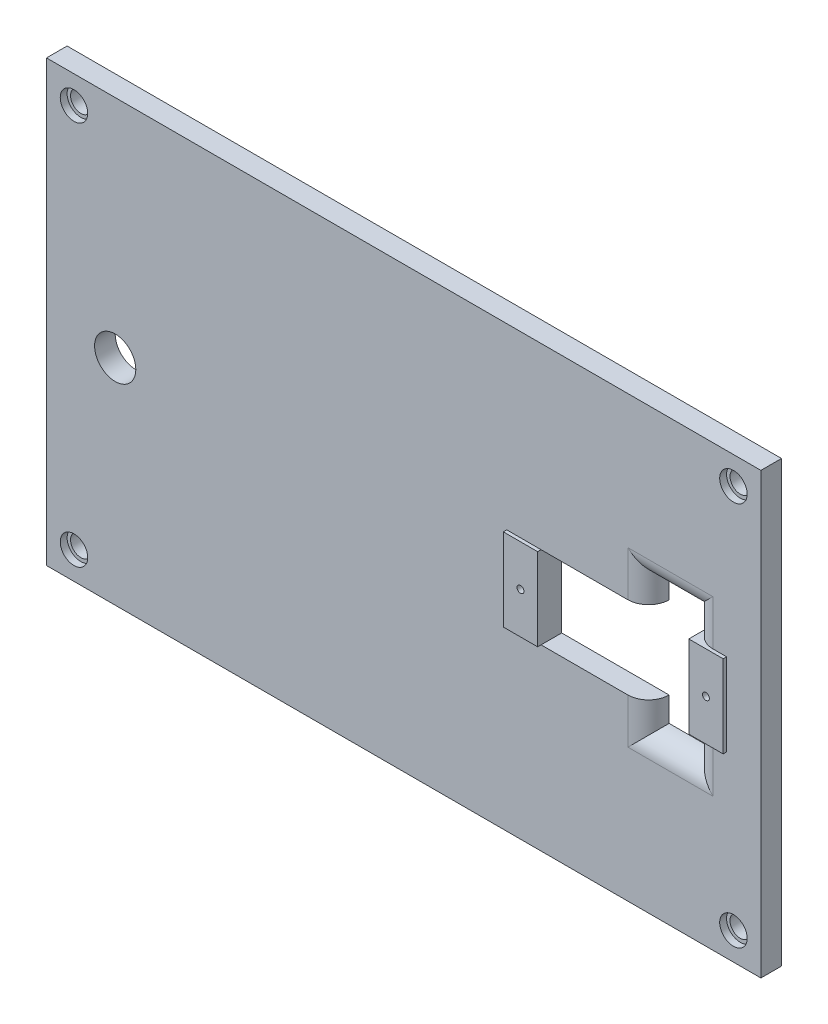
ISO-10303-21;
HEADER;
FILE_DESCRIPTION(('STEP AP214'),'2;1');
FILE_NAME('part.step','',(''),(''),'','','');
FILE_SCHEMA(('AUTOMOTIVE_DESIGN { 1 0 10303 214 1 1 1 1 }'));
ENDSEC;
DATA;
#1=APPLICATION_CONTEXT('core data for automotive mechanical design processes');
#2=APPLICATION_PROTOCOL_DEFINITION('international standard','automotive_design',2000,#1);
#3=PRODUCT_CONTEXT('',#1,'mechanical');
#4=PRODUCT('Part','Part','',(#3));
#5=PRODUCT_RELATED_PRODUCT_CATEGORY('part','',(#4));
#6=PRODUCT_DEFINITION_FORMATION('','',#4);
#7=PRODUCT_DEFINITION_CONTEXT('part definition',#1,'design');
#8=PRODUCT_DEFINITION('design','',#6,#7);
#9=PRODUCT_DEFINITION_SHAPE('','',#8);
#10=(LENGTH_UNIT() NAMED_UNIT(*) SI_UNIT(.MILLI.,.METRE.));
#11=(NAMED_UNIT(*) PLANE_ANGLE_UNIT() SI_UNIT($,.RADIAN.));
#12=(NAMED_UNIT(*) SI_UNIT($,.STERADIAN.) SOLID_ANGLE_UNIT());
#13=UNCERTAINTY_MEASURE_WITH_UNIT(LENGTH_MEASURE(1.E-05),#10,'distance_accuracy_value','');
#14=(GEOMETRIC_REPRESENTATION_CONTEXT(3) GLOBAL_UNCERTAINTY_ASSIGNED_CONTEXT((#13)) GLOBAL_UNIT_ASSIGNED_CONTEXT((#10,
#11,#12)) REPRESENTATION_CONTEXT('',''));
#15=CARTESIAN_POINT('',(0.,0.,0.));
#16=DIRECTION('',(0.,0.,1.));
#17=DIRECTION('',(1.,0.,0.));
#18=AXIS2_PLACEMENT_3D('',#15,#16,#17);
#19=CARTESIAN_POINT('',(0.,0.,3.));
#20=DIRECTION('',(0.,0.,1.));
#21=DIRECTION('',(1.,0.,0.));
#22=AXIS2_PLACEMENT_3D('',#19,#20,#21);
#23=PLANE('',#22);
#24=CARTESIAN_POINT('',(-42.,-0.800014707642719,3.));
#25=DIRECTION('',(0.,0.,1.));
#26=DIRECTION('',(1.,0.,0.));
#27=AXIS2_PLACEMENT_3D('',#24,#25,#26);
#28=CIRCLE('',#27,3.);
#29=CARTESIAN_POINT('',(-39.,-0.800014707642719,3.));
#30=VERTEX_POINT('',#29);
#31=EDGE_CURVE('E250',#30,#30,#28,.T.);
#32=ORIENTED_EDGE('',*,*,#31,.F.);
#33=EDGE_LOOP('',(#32));
#34=FACE_BOUND('',#33,.T.);
#35=DIRECTION('',(1.,0.,0.));
#36=VECTOR('',#35,1.);
#37=CARTESIAN_POINT('',(35.6418315006416,-12.5801465050142,3.));
#38=LINE('',#37,#36);
#39=CARTESIAN_POINT('',(45.,-12.5801465050142,3.));
#40=VERTEX_POINT('',#39);
#41=CARTESIAN_POINT('',(32.6418315006416,-12.5801465050142,3.));
#42=VERTEX_POINT('',#41);
#43=EDGE_CURVE('E212',#40,#42,#38,.F.);
#44=ORIENTED_EDGE('',*,*,#43,.T.);
#45=DIRECTION('',(0.,-1.,0.));
#46=VECTOR('',#45,1.);
#47=CARTESIAN_POINT('',(32.6418315006416,-6.,3.));
#48=LINE('',#47,#46);
#49=CARTESIAN_POINT('',(32.6418315006416,-6.,3.));
#50=VERTEX_POINT('',#49);
#51=EDGE_CURVE('E478',#42,#50,#48,.F.);
#52=ORIENTED_EDGE('',*,*,#51,.T.);
#53=DIRECTION('',(1.,0.,0.));
#54=VECTOR('',#53,1.);
#55=CARTESIAN_POINT('',(20.,-6.,3.));
#56=LINE('',#55,#54);
#57=CARTESIAN_POINT('',(20.,-6.,3.));
#58=VERTEX_POINT('',#57);
#59=EDGE_CURVE('E243',#58,#50,#56,.T.);
#60=ORIENTED_EDGE('',*,*,#59,.F.);
#61=DIRECTION('',(1.,0.,0.));
#62=VECTOR('',#61,1.);
#63=CARTESIAN_POINT('',(15.,-6.,3.));
#64=LINE('',#63,#62);
#65=CARTESIAN_POINT('',(15.,-6.,3.));
#66=VERTEX_POINT('',#65);
#67=EDGE_CURVE('E326',#66,#58,#64,.T.);
#68=ORIENTED_EDGE('',*,*,#67,.F.);
#69=DIRECTION('',(0.,-1.,0.));
#70=VECTOR('',#69,1.);
#71=CARTESIAN_POINT('',(15.,-6.,3.));
#72=LINE('',#71,#70);
#73=CARTESIAN_POINT('',(15.,6.,3.));
#74=VERTEX_POINT('',#73);
#75=EDGE_CURVE('E338',#74,#66,#72,.T.);
#76=ORIENTED_EDGE('',*,*,#75,.F.);
#77=DIRECTION('',(-1.,0.,0.));
#78=VECTOR('',#77,1.);
#79=CARTESIAN_POINT('',(15.,6.,3.));
#80=LINE('',#79,#78);
#81=CARTESIAN_POINT('',(20.,6.,3.));
#82=VERTEX_POINT('',#81);
#83=EDGE_CURVE('E320',#82,#74,#80,.T.);
#84=ORIENTED_EDGE('',*,*,#83,.F.);
#85=DIRECTION('',(-1.,0.,0.));
#86=VECTOR('',#85,1.);
#87=CARTESIAN_POINT('',(20.,6.,3.));
#88=LINE('',#87,#86);
#89=CARTESIAN_POINT('',(32.6418315006416,6.,3.));
#90=VERTEX_POINT('',#89);
#91=EDGE_CURVE('E246',#90,#82,#88,.T.);
#92=ORIENTED_EDGE('',*,*,#91,.F.);
#93=DIRECTION('',(0.,-1.,0.));
#94=VECTOR('',#93,1.);
#95=CARTESIAN_POINT('',(32.6418315006416,9.58014650501422,3.));
#96=LINE('',#95,#94);
#97=CARTESIAN_POINT('',(32.6418315006416,12.5801465050142,3.));
#98=VERTEX_POINT('',#97);
#99=EDGE_CURVE('E239',#90,#98,#96,.F.);
#100=ORIENTED_EDGE('',*,*,#99,.T.);
#101=DIRECTION('',(-1.,0.,0.));
#102=VECTOR('',#101,1.);
#103=CARTESIAN_POINT('',(42.,12.5801465050142,3.));
#104=LINE('',#103,#102);
#105=CARTESIAN_POINT('',(45.,12.5801465050142,3.));
#106=VERTEX_POINT('',#105);
#107=EDGE_CURVE('E234',#98,#106,#104,.F.);
#108=ORIENTED_EDGE('',*,*,#107,.T.);
#109=DIRECTION('',(0.,1.,0.));
#110=VECTOR('',#109,1.);
#111=CARTESIAN_POINT('',(45.,6.,3.));
#112=LINE('',#111,#110);
#113=CARTESIAN_POINT('',(45.,6.,3.));
#114=VERTEX_POINT('',#113);
#115=EDGE_CURVE('E470',#106,#114,#112,.F.);
#116=ORIENTED_EDGE('',*,*,#115,.T.);
#117=DIRECTION('',(-1.,0.,0.));
#118=VECTOR('',#117,1.);
#119=CARTESIAN_POINT('',(42.,6.,3.));
#120=LINE('',#119,#118);
#121=CARTESIAN_POINT('',(47.,6.,3.));
#122=VERTEX_POINT('',#121);
#123=EDGE_CURVE('E304',#122,#114,#120,.T.);
#124=ORIENTED_EDGE('',*,*,#123,.F.);
#125=DIRECTION('',(0.,1.,0.));
#126=VECTOR('',#125,1.);
#127=CARTESIAN_POINT('',(47.,-6.,3.));
#128=LINE('',#127,#126);
#129=CARTESIAN_POINT('',(47.,-6.,3.));
#130=VERTEX_POINT('',#129);
#131=EDGE_CURVE('E274',#130,#122,#128,.T.);
#132=ORIENTED_EDGE('',*,*,#131,.F.);
#133=DIRECTION('',(1.,0.,0.));
#134=VECTOR('',#133,1.);
#135=CARTESIAN_POINT('',(42.,-6.,3.));
#136=LINE('',#135,#134);
#137=CARTESIAN_POINT('',(45.,-6.,3.));
#138=VERTEX_POINT('',#137);
#139=EDGE_CURVE('E291',#138,#130,#136,.T.);
#140=ORIENTED_EDGE('',*,*,#139,.F.);
#141=DIRECTION('',(0.,1.,0.));
#142=VECTOR('',#141,1.);
#143=CARTESIAN_POINT('',(45.,-9.58014650501422,3.));
#144=LINE('',#143,#142);
#145=EDGE_CURVE('E473',#138,#40,#144,.F.);
#146=ORIENTED_EDGE('',*,*,#145,.T.);
#147=EDGE_LOOP('',(#44,#52,#60,#68,#76,#84,#92,#100,#108,#116,#124,#132,#140,#146));
#148=FACE_BOUND('',#147,.T.);
#149=CARTESIAN_POINT('',(48.,-28.,3.));
#150=DIRECTION('',(0.,0.,1.));
#151=DIRECTION('',(-1.,0.,0.));
#152=AXIS2_PLACEMENT_3D('',#149,#150,#151);
#153=CIRCLE('',#152,2.);
#154=CARTESIAN_POINT('',(46.,-28.,3.));
#155=VERTEX_POINT('',#154);
#156=EDGE_CURVE('E359',#155,#155,#153,.T.);
#157=ORIENTED_EDGE('',*,*,#156,.F.);
#158=EDGE_LOOP('',(#157));
#159=FACE_BOUND('',#158,.T.);
#160=CARTESIAN_POINT('',(-48.,-28.,3.));
#161=DIRECTION('',(0.,0.,1.));
#162=DIRECTION('',(1.,0.,0.));
#163=AXIS2_PLACEMENT_3D('',#160,#161,#162);
#164=CIRCLE('',#163,2.);
#165=CARTESIAN_POINT('',(-46.,-28.,3.));
#166=VERTEX_POINT('',#165);
#167=EDGE_CURVE('E373',#166,#166,#164,.T.);
#168=ORIENTED_EDGE('',*,*,#167,.F.);
#169=EDGE_LOOP('',(#168));
#170=FACE_BOUND('',#169,.T.);
#171=CARTESIAN_POINT('',(-48.,28.,3.));
#172=DIRECTION('',(0.,0.,1.));
#173=DIRECTION('',(-1.,0.,0.));
#174=AXIS2_PLACEMENT_3D('',#171,#172,#173);
#175=CIRCLE('',#174,2.);
#176=CARTESIAN_POINT('',(-50.,28.,3.));
#177=VERTEX_POINT('',#176);
#178=EDGE_CURVE('E365',#177,#177,#175,.T.);
#179=ORIENTED_EDGE('',*,*,#178,.F.);
#180=EDGE_LOOP('',(#179));
#181=FACE_BOUND('',#180,.T.);
#182=CARTESIAN_POINT('',(48.,28.,3.));
#183=DIRECTION('',(0.,0.,1.));
#184=DIRECTION('',(1.,0.,0.));
#185=AXIS2_PLACEMENT_3D('',#182,#183,#184);
#186=CIRCLE('',#185,2.);
#187=CARTESIAN_POINT('',(50.,28.,3.));
#188=VERTEX_POINT('',#187);
#189=EDGE_CURVE('E364',#188,#188,#186,.T.);
#190=ORIENTED_EDGE('',*,*,#189,.F.);
#191=EDGE_LOOP('',(#190));
#192=FACE_BOUND('',#191,.T.);
#193=DIRECTION('',(0.,-1.,0.));
#194=VECTOR('',#193,1.);
#195=CARTESIAN_POINT('',(-52.,-32.,3.));
#196=LINE('',#195,#194);
#197=CARTESIAN_POINT('',(-52.,32.,3.));
#198=VERTEX_POINT('',#197);
#199=CARTESIAN_POINT('',(-52.,-32.,3.));
#200=VERTEX_POINT('',#199);
#201=EDGE_CURVE('E410',#198,#200,#196,.T.);
#202=ORIENTED_EDGE('',*,*,#201,.T.);
#203=DIRECTION('',(1.,0.,0.));
#204=VECTOR('',#203,1.);
#205=CARTESIAN_POINT('',(52.,-32.,3.));
#206=LINE('',#205,#204);
#207=CARTESIAN_POINT('',(52.,-32.,3.));
#208=VERTEX_POINT('',#207);
#209=EDGE_CURVE('E414',#200,#208,#206,.T.);
#210=ORIENTED_EDGE('',*,*,#209,.T.);
#211=DIRECTION('',(0.,1.,0.));
#212=VECTOR('',#211,1.);
#213=CARTESIAN_POINT('',(52.,-32.,3.));
#214=LINE('',#213,#212);
#215=CARTESIAN_POINT('',(52.,32.,3.));
#216=VERTEX_POINT('',#215);
#217=EDGE_CURVE('E418',#208,#216,#214,.T.);
#218=ORIENTED_EDGE('',*,*,#217,.T.);
#219=DIRECTION('',(-1.,0.,0.));
#220=VECTOR('',#219,1.);
#221=CARTESIAN_POINT('',(52.,32.,3.));
#222=LINE('',#221,#220);
#223=EDGE_CURVE('E421',#216,#198,#222,.T.);
#224=ORIENTED_EDGE('',*,*,#223,.T.);
#225=EDGE_LOOP('',(#202,#210,#218,#224));
#226=FACE_BOUND('',#225,.T.);
#227=ADVANCED_FACE('F41',(#34,#148,#159,#170,#181,#192,#226),#23,.T.);
#228=CARTESIAN_POINT('',(48.,28.,0.));
#229=DIRECTION('',(0.,0.,1.));
#230=DIRECTION('',(1.,0.,0.));
#231=AXIS2_PLACEMENT_3D('',#228,#229,#230);
#232=CYLINDRICAL_SURFACE('',#231,1.5);
#233=CARTESIAN_POINT('',(48.,28.,0.));
#234=DIRECTION('',(0.,0.,1.));
#235=DIRECTION('',(-1.,0.,0.));
#236=AXIS2_PLACEMENT_3D('',#233,#234,#235);
#237=CIRCLE('',#236,1.5);
#238=CARTESIAN_POINT('',(46.5,28.,0.));
#239=VERTEX_POINT('',#238);
#240=EDGE_CURVE('E392',#239,#239,#237,.T.);
#241=ORIENTED_EDGE('',*,*,#240,.F.);
#242=EDGE_LOOP('',(#241));
#243=FACE_BOUND('',#242,.T.);
#244=CARTESIAN_POINT('',(48.,28.,2.));
#245=DIRECTION('',(0.,0.,1.));
#246=DIRECTION('',(1.,0.,0.));
#247=AXIS2_PLACEMENT_3D('',#244,#245,#246);
#248=CIRCLE('',#247,1.5);
#249=CARTESIAN_POINT('',(49.5,28.,2.));
#250=VERTEX_POINT('',#249);
#251=EDGE_CURVE('E457',#250,#250,#248,.F.);
#252=ORIENTED_EDGE('',*,*,#251,.F.);
#253=EDGE_LOOP('',(#252));
#254=FACE_BOUND('',#253,.T.);
#255=ADVANCED_FACE('F520',(#243,#254),#232,.F.);
#256=CARTESIAN_POINT('',(-48.,-28.,0.));
#257=DIRECTION('',(0.,0.,1.));
#258=DIRECTION('',(1.,0.,0.));
#259=AXIS2_PLACEMENT_3D('',#256,#257,#258);
#260=CYLINDRICAL_SURFACE('',#259,1.5);
#261=CARTESIAN_POINT('',(-48.,-28.,0.));
#262=DIRECTION('',(0.,0.,1.));
#263=DIRECTION('',(-1.,0.,0.));
#264=AXIS2_PLACEMENT_3D('',#261,#262,#263);
#265=CIRCLE('',#264,1.5);
#266=CARTESIAN_POINT('',(-49.5,-28.,0.));
#267=VERTEX_POINT('',#266);
#268=EDGE_CURVE('E401',#267,#267,#265,.T.);
#269=ORIENTED_EDGE('',*,*,#268,.F.);
#270=EDGE_LOOP('',(#269));
#271=FACE_BOUND('',#270,.T.);
#272=CARTESIAN_POINT('',(-48.,-28.,2.));
#273=DIRECTION('',(0.,0.,1.));
#274=DIRECTION('',(1.,0.,0.));
#275=AXIS2_PLACEMENT_3D('',#272,#273,#274);
#276=CIRCLE('',#275,1.5);
#277=CARTESIAN_POINT('',(-46.5,-28.,2.));
#278=VERTEX_POINT('',#277);
#279=EDGE_CURVE('E388',#278,#278,#276,.F.);
#280=ORIENTED_EDGE('',*,*,#279,.F.);
#281=EDGE_LOOP('',(#280));
#282=FACE_BOUND('',#281,.T.);
#283=ADVANCED_FACE('F526',(#271,#282),#260,.F.);
#284=CARTESIAN_POINT('',(-52.,-32.,3.));
#285=DIRECTION('',(1.,0.,0.));
#286=DIRECTION('',(0.,0.,-1.));
#287=AXIS2_PLACEMENT_3D('',#284,#285,#286);
#288=PLANE('',#287);
#289=DIRECTION('',(0.,-1.,0.));
#290=VECTOR('',#289,1.);
#291=CARTESIAN_POINT('',(-52.,-32.,0.));
#292=LINE('',#291,#290);
#293=CARTESIAN_POINT('',(-52.,32.,0.));
#294=VERTEX_POINT('',#293);
#295=CARTESIAN_POINT('',(-52.,-32.,0.));
#296=VERTEX_POINT('',#295);
#297=EDGE_CURVE('E409',#294,#296,#292,.T.);
#298=ORIENTED_EDGE('',*,*,#297,.T.);
#299=DIRECTION('',(0.,0.,-1.));
#300=VECTOR('',#299,1.);
#301=CARTESIAN_POINT('',(-52.,-32.,3.));
#302=LINE('',#301,#300);
#303=EDGE_CURVE('E198',#200,#296,#302,.T.);
#304=ORIENTED_EDGE('',*,*,#303,.F.);
#305=ORIENTED_EDGE('',*,*,#201,.F.);
#306=DIRECTION('',(0.,0.,-1.));
#307=VECTOR('',#306,1.);
#308=CARTESIAN_POINT('',(-52.,32.,3.));
#309=LINE('',#308,#307);
#310=EDGE_CURVE('E424',#198,#294,#309,.T.);
#311=ORIENTED_EDGE('',*,*,#310,.T.);
#312=EDGE_LOOP('',(#298,#304,#305,#311));
#313=FACE_BOUND('',#312,.T.);
#314=ADVANCED_FACE('F548',(#313),#288,.F.);
#315=CARTESIAN_POINT('',(52.,-32.,3.));
#316=DIRECTION('',(0.,1.,0.));
#317=DIRECTION('',(-1.,0.,0.));
#318=AXIS2_PLACEMENT_3D('',#315,#316,#317);
#319=PLANE('',#318);
#320=DIRECTION('',(1.,0.,0.));
#321=VECTOR('',#320,1.);
#322=CARTESIAN_POINT('',(52.,-32.,0.));
#323=LINE('',#322,#321);
#324=CARTESIAN_POINT('',(52.,-32.,0.));
#325=VERTEX_POINT('',#324);
#326=EDGE_CURVE('E428',#296,#325,#323,.T.);
#327=ORIENTED_EDGE('',*,*,#326,.T.);
#328=DIRECTION('',(0.,0.,-1.));
#329=VECTOR('',#328,1.);
#330=CARTESIAN_POINT('',(52.,-32.,3.));
#331=LINE('',#330,#329);
#332=EDGE_CURVE('E443',#208,#325,#331,.T.);
#333=ORIENTED_EDGE('',*,*,#332,.F.);
#334=ORIENTED_EDGE('',*,*,#209,.F.);
#335=ORIENTED_EDGE('',*,*,#303,.T.);
#336=EDGE_LOOP('',(#327,#333,#334,#335));
#337=FACE_BOUND('',#336,.T.);
#338=ADVANCED_FACE('F544',(#337),#319,.F.);
#339=CARTESIAN_POINT('',(52.,-32.,3.));
#340=DIRECTION('',(-1.,0.,0.));
#341=DIRECTION('',(0.,0.,1.));
#342=AXIS2_PLACEMENT_3D('',#339,#340,#341);
#343=PLANE('',#342);
#344=DIRECTION('',(0.,1.,0.));
#345=VECTOR('',#344,1.);
#346=CARTESIAN_POINT('',(52.,-32.,0.));
#347=LINE('',#346,#345);
#348=CARTESIAN_POINT('',(52.,32.,0.));
#349=VERTEX_POINT('',#348);
#350=EDGE_CURVE('E431',#325,#349,#347,.T.);
#351=ORIENTED_EDGE('',*,*,#350,.T.);
#352=DIRECTION('',(0.,0.,-1.));
#353=VECTOR('',#352,1.);
#354=CARTESIAN_POINT('',(52.,32.,3.));
#355=LINE('',#354,#353);
#356=EDGE_CURVE('E439',#216,#349,#355,.T.);
#357=ORIENTED_EDGE('',*,*,#356,.F.);
#358=ORIENTED_EDGE('',*,*,#217,.F.);
#359=ORIENTED_EDGE('',*,*,#332,.T.);
#360=EDGE_LOOP('',(#351,#357,#358,#359));
#361=FACE_BOUND('',#360,.T.);
#362=ADVANCED_FACE('F540',(#361),#343,.F.);
#363=CARTESIAN_POINT('',(52.,32.,3.));
#364=DIRECTION('',(0.,-1.,0.));
#365=DIRECTION('',(1.,0.,0.));
#366=AXIS2_PLACEMENT_3D('',#363,#364,#365);
#367=PLANE('',#366);
#368=DIRECTION('',(-1.,0.,0.));
#369=VECTOR('',#368,1.);
#370=CARTESIAN_POINT('',(52.,32.,0.));
#371=LINE('',#370,#369);
#372=EDGE_CURVE('E415',#349,#294,#371,.T.);
#373=ORIENTED_EDGE('',*,*,#372,.T.);
#374=ORIENTED_EDGE('',*,*,#310,.F.);
#375=ORIENTED_EDGE('',*,*,#223,.F.);
#376=ORIENTED_EDGE('',*,*,#356,.T.);
#377=EDGE_LOOP('',(#373,#374,#375,#376));
#378=FACE_BOUND('',#377,.T.);
#379=ADVANCED_FACE('F536',(#378),#367,.F.);
#380=CARTESIAN_POINT('',(0.,0.,0.));
#381=DIRECTION('',(0.,0.,1.));
#382=DIRECTION('',(1.,0.,0.));
#383=AXIS2_PLACEMENT_3D('',#380,#381,#382);
#384=PLANE('',#383);
#385=CARTESIAN_POINT('',(-42.,-0.800014707642719,0.));
#386=DIRECTION('',(0.,0.,1.));
#387=DIRECTION('',(1.,0.,0.));
#388=AXIS2_PLACEMENT_3D('',#385,#386,#387);
#389=CIRCLE('',#388,3.);
#390=CARTESIAN_POINT('',(-39.,-0.800014707642719,0.));
#391=VERTEX_POINT('',#390);
#392=EDGE_CURVE('E45',#391,#391,#389,.T.);
#393=ORIENTED_EDGE('',*,*,#392,.T.);
#394=EDGE_LOOP('',(#393));
#395=FACE_BOUND('',#394,.T.);
#396=DIRECTION('',(-1.,0.,0.));
#397=VECTOR('',#396,1.);
#398=CARTESIAN_POINT('',(0.,9.58014650501422,0.));
#399=LINE('',#398,#397);
#400=CARTESIAN_POINT('',(42.,9.58014650501422,0.));
#401=VERTEX_POINT('',#400);
#402=CARTESIAN_POINT('',(35.6418315006416,9.58014650501422,0.));
#403=VERTEX_POINT('',#402);
#404=EDGE_CURVE('E197',#401,#403,#399,.T.);
#405=ORIENTED_EDGE('',*,*,#404,.T.);
#406=DIRECTION('',(0.,-1.,0.));
#407=VECTOR('',#406,1.);
#408=CARTESIAN_POINT('',(35.6418315006416,0.,0.));
#409=LINE('',#408,#407);
#410=CARTESIAN_POINT('',(35.6418315006416,6.,0.));
#411=VERTEX_POINT('',#410);
#412=EDGE_CURVE('E218',#403,#411,#409,.T.);
#413=ORIENTED_EDGE('',*,*,#412,.T.);
#414=DIRECTION('',(-1.,0.,0.));
#415=VECTOR('',#414,1.);
#416=CARTESIAN_POINT('',(20.,6.,0.));
#417=LINE('',#416,#415);
#418=CARTESIAN_POINT('',(20.,6.,0.));
#419=VERTEX_POINT('',#418);
#420=EDGE_CURVE('E207',#411,#419,#417,.T.);
#421=ORIENTED_EDGE('',*,*,#420,.T.);
#422=DIRECTION('',(0.,-1.,0.));
#423=VECTOR('',#422,1.);
#424=CARTESIAN_POINT('',(20.,6.,0.));
#425=LINE('',#424,#423);
#426=CARTESIAN_POINT('',(20.,-6.,0.));
#427=VERTEX_POINT('',#426);
#428=EDGE_CURVE('E251',#419,#427,#425,.T.);
#429=ORIENTED_EDGE('',*,*,#428,.T.);
#430=DIRECTION('',(1.,0.,0.));
#431=VECTOR('',#430,1.);
#432=CARTESIAN_POINT('',(20.,-6.,0.));
#433=LINE('',#432,#431);
#434=CARTESIAN_POINT('',(35.6418315006416,-6.,0.));
#435=VERTEX_POINT('',#434);
#436=EDGE_CURVE('E255',#427,#435,#433,.T.);
#437=ORIENTED_EDGE('',*,*,#436,.T.);
#438=CARTESIAN_POINT('',(35.6418315006416,-9.58014650501422,0.));
#439=VERTEX_POINT('',#438);
#440=EDGE_CURVE('E192',#435,#439,#409,.T.);
#441=ORIENTED_EDGE('',*,*,#440,.T.);
#442=DIRECTION('',(1.,0.,0.));
#443=VECTOR('',#442,1.);
#444=CARTESIAN_POINT('',(0.,-9.58014650501422,0.));
#445=LINE('',#444,#443);
#446=CARTESIAN_POINT('',(42.,-9.58014650501422,0.));
#447=VERTEX_POINT('',#446);
#448=EDGE_CURVE('E183',#439,#447,#445,.T.);
#449=ORIENTED_EDGE('',*,*,#448,.T.);
#450=DIRECTION('',(0.,1.,0.));
#451=VECTOR('',#450,1.);
#452=CARTESIAN_POINT('',(42.,6.,0.));
#453=LINE('',#452,#451);
#454=CARTESIAN_POINT('',(42.,-6.,0.));
#455=VERTEX_POINT('',#454);
#456=EDGE_CURVE('E188',#447,#455,#453,.T.);
#457=ORIENTED_EDGE('',*,*,#456,.T.);
#458=CARTESIAN_POINT('',(42.,6.,0.));
#459=VERTEX_POINT('',#458);
#460=EDGE_CURVE('E208',#455,#459,#453,.T.);
#461=ORIENTED_EDGE('',*,*,#460,.T.);
#462=EDGE_CURVE('E210',#459,#401,#453,.T.);
#463=ORIENTED_EDGE('',*,*,#462,.T.);
#464=EDGE_LOOP('',(#405,#413,#421,#429,#437,#441,#449,#457,#461,#463));
#465=FACE_BOUND('',#464,.T.);
#466=CARTESIAN_POINT('',(17.5,0.,0.));
#467=DIRECTION('',(0.,0.,1.));
#468=DIRECTION('',(1.,0.,0.));
#469=AXIS2_PLACEMENT_3D('',#466,#467,#468);
#470=CIRCLE('',#469,0.499999999999999);
#471=CARTESIAN_POINT('',(18.,0.,0.));
#472=VERTEX_POINT('',#471);
#473=EDGE_CURVE('E270',#472,#472,#470,.T.);
#474=ORIENTED_EDGE('',*,*,#473,.T.);
#475=EDGE_LOOP('',(#474));
#476=FACE_BOUND('',#475,.T.);
#477=CARTESIAN_POINT('',(44.5,0.,0.));
#478=DIRECTION('',(0.,0.,1.));
#479=DIRECTION('',(1.,0.,0.));
#480=AXIS2_PLACEMENT_3D('',#477,#478,#479);
#481=CIRCLE('',#480,0.499999999999999);
#482=CARTESIAN_POINT('',(45.,0.,0.));
#483=VERTEX_POINT('',#482);
#484=EDGE_CURVE('E279',#483,#483,#481,.T.);
#485=ORIENTED_EDGE('',*,*,#484,.T.);
#486=EDGE_LOOP('',(#485));
#487=FACE_BOUND('',#486,.T.);
#488=ORIENTED_EDGE('',*,*,#268,.T.);
#489=EDGE_LOOP('',(#488));
#490=FACE_BOUND('',#489,.T.);
#491=CARTESIAN_POINT('',(48.,-28.,0.));
#492=DIRECTION('',(0.,0.,1.));
#493=DIRECTION('',(1.,0.,0.));
#494=AXIS2_PLACEMENT_3D('',#491,#492,#493);
#495=CIRCLE('',#494,1.5);
#496=CARTESIAN_POINT('',(49.5,-28.,0.));
#497=VERTEX_POINT('',#496);
#498=EDGE_CURVE('E397',#497,#497,#495,.T.);
#499=ORIENTED_EDGE('',*,*,#498,.T.);
#500=EDGE_LOOP('',(#499));
#501=FACE_BOUND('',#500,.T.);
#502=ORIENTED_EDGE('',*,*,#240,.T.);
#503=EDGE_LOOP('',(#502));
#504=FACE_BOUND('',#503,.T.);
#505=CARTESIAN_POINT('',(-48.,28.,0.));
#506=DIRECTION('',(0.,0.,1.));
#507=DIRECTION('',(1.,0.,0.));
#508=AXIS2_PLACEMENT_3D('',#505,#506,#507);
#509=CIRCLE('',#508,1.5);
#510=CARTESIAN_POINT('',(-46.5,28.,0.));
#511=VERTEX_POINT('',#510);
#512=EDGE_CURVE('E396',#511,#511,#509,.T.);
#513=ORIENTED_EDGE('',*,*,#512,.T.);
#514=EDGE_LOOP('',(#513));
#515=FACE_BOUND('',#514,.T.);
#516=ORIENTED_EDGE('',*,*,#297,.F.);
#517=ORIENTED_EDGE('',*,*,#372,.F.);
#518=ORIENTED_EDGE('',*,*,#350,.F.);
#519=ORIENTED_EDGE('',*,*,#326,.F.);
#520=EDGE_LOOP('',(#516,#517,#518,#519));
#521=FACE_BOUND('',#520,.T.);
#522=ADVANCED_FACE('F185',(#395,#465,#476,#487,#490,#501,#504,#515,#521),#384,.F.);
#523=CARTESIAN_POINT('',(-48.,28.,0.));
#524=DIRECTION('',(0.,0.,1.));
#525=DIRECTION('',(1.,0.,0.));
#526=AXIS2_PLACEMENT_3D('',#523,#524,#525);
#527=CYLINDRICAL_SURFACE('',#526,1.5);
#528=CARTESIAN_POINT('',(-48.,28.,2.));
#529=DIRECTION('',(0.,0.,-1.));
#530=DIRECTION('',(-1.,0.,0.));
#531=AXIS2_PLACEMENT_3D('',#528,#529,#530);
#532=CIRCLE('',#531,1.5);
#533=CARTESIAN_POINT('',(-49.5,28.,2.));
#534=VERTEX_POINT('',#533);
#535=EDGE_CURVE('E405',#534,#534,#532,.F.);
#536=ORIENTED_EDGE('',*,*,#535,.T.);
#537=EDGE_LOOP('',(#536));
#538=FACE_BOUND('',#537,.T.);
#539=ORIENTED_EDGE('',*,*,#512,.F.);
#540=EDGE_LOOP('',(#539));
#541=FACE_BOUND('',#540,.T.);
#542=ADVANCED_FACE('F532',(#538,#541),#527,.F.);
#543=CARTESIAN_POINT('',(48.,-28.,0.));
#544=DIRECTION('',(0.,0.,1.));
#545=DIRECTION('',(1.,0.,0.));
#546=AXIS2_PLACEMENT_3D('',#543,#544,#545);
#547=CYLINDRICAL_SURFACE('',#546,1.5);
#548=CARTESIAN_POINT('',(48.,-28.,2.));
#549=DIRECTION('',(0.,0.,-1.));
#550=DIRECTION('',(-1.,0.,0.));
#551=AXIS2_PLACEMENT_3D('',#548,#549,#550);
#552=CIRCLE('',#551,1.5);
#553=CARTESIAN_POINT('',(46.5,-28.,2.));
#554=VERTEX_POINT('',#553);
#555=EDGE_CURVE('E453',#554,#554,#552,.F.);
#556=ORIENTED_EDGE('',*,*,#555,.T.);
#557=EDGE_LOOP('',(#556));
#558=FACE_BOUND('',#557,.T.);
#559=ORIENTED_EDGE('',*,*,#498,.F.);
#560=EDGE_LOOP('',(#559));
#561=FACE_BOUND('',#560,.T.);
#562=ADVANCED_FACE('F740',(#558,#561),#547,.F.);
#563=CARTESIAN_POINT('',(-48.,-28.,2.));
#564=DIRECTION('',(0.,0.,1.));
#565=DIRECTION('',(1.,0.,0.));
#566=AXIS2_PLACEMENT_3D('',#563,#564,#565);
#567=PLANE('',#566);
#568=CARTESIAN_POINT('',(-48.,-28.,2.));
#569=DIRECTION('',(0.,0.,1.));
#570=DIRECTION('',(1.,0.,0.));
#571=AXIS2_PLACEMENT_3D('',#568,#569,#570);
#572=CIRCLE('',#571,2.);
#573=CARTESIAN_POINT('',(-46.,-28.,2.));
#574=VERTEX_POINT('',#573);
#575=EDGE_CURVE('E369',#574,#574,#572,.T.);
#576=ORIENTED_EDGE('',*,*,#575,.T.);
#577=EDGE_LOOP('',(#576));
#578=FACE_BOUND('',#577,.T.);
#579=ORIENTED_EDGE('',*,*,#279,.T.);
#580=EDGE_LOOP('',(#579));
#581=FACE_BOUND('',#580,.T.);
#582=ADVANCED_FACE('F732',(#578,#581),#567,.T.);
#583=CARTESIAN_POINT('',(-48.,-28.,2.));
#584=DIRECTION('',(0.,0.,1.));
#585=DIRECTION('',(1.,0.,0.));
#586=AXIS2_PLACEMENT_3D('',#583,#584,#585);
#587=CYLINDRICAL_SURFACE('',#586,2.);
#588=ORIENTED_EDGE('',*,*,#575,.F.);
#589=EDGE_LOOP('',(#588));
#590=FACE_BOUND('',#589,.T.);
#591=ORIENTED_EDGE('',*,*,#167,.T.);
#592=EDGE_LOOP('',(#591));
#593=FACE_BOUND('',#592,.T.);
#594=ADVANCED_FACE('F724',(#590,#593),#587,.F.);
#595=CARTESIAN_POINT('',(48.,-28.,2.));
#596=DIRECTION('',(0.,0.,-1.));
#597=DIRECTION('',(-1.,0.,0.));
#598=AXIS2_PLACEMENT_3D('',#595,#596,#597);
#599=PLANE('',#598);
#600=CARTESIAN_POINT('',(48.,-28.,2.));
#601=DIRECTION('',(0.,0.,1.));
#602=DIRECTION('',(-1.,0.,0.));
#603=AXIS2_PLACEMENT_3D('',#600,#601,#602);
#604=CIRCLE('',#603,2.);
#605=CARTESIAN_POINT('',(46.,-28.,2.));
#606=VERTEX_POINT('',#605);
#607=EDGE_CURVE('E377',#606,#606,#604,.T.);
#608=ORIENTED_EDGE('',*,*,#607,.T.);
#609=EDGE_LOOP('',(#608));
#610=FACE_BOUND('',#609,.T.);
#611=ORIENTED_EDGE('',*,*,#555,.F.);
#612=EDGE_LOOP('',(#611));
#613=FACE_BOUND('',#612,.T.);
#614=ADVANCED_FACE('F716',(#610,#613),#599,.F.);
#615=CARTESIAN_POINT('',(48.,-28.,2.));
#616=DIRECTION('',(0.,0.,1.));
#617=DIRECTION('',(1.,0.,0.));
#618=AXIS2_PLACEMENT_3D('',#615,#616,#617);
#619=CYLINDRICAL_SURFACE('',#618,2.);
#620=ORIENTED_EDGE('',*,*,#607,.F.);
#621=EDGE_LOOP('',(#620));
#622=FACE_BOUND('',#621,.T.);
#623=ORIENTED_EDGE('',*,*,#156,.T.);
#624=EDGE_LOOP('',(#623));
#625=FACE_BOUND('',#624,.T.);
#626=ADVANCED_FACE('F708',(#622,#625),#619,.F.);
#627=CARTESIAN_POINT('',(48.,28.,2.));
#628=DIRECTION('',(0.,0.,1.));
#629=DIRECTION('',(1.,0.,0.));
#630=AXIS2_PLACEMENT_3D('',#627,#628,#629);
#631=PLANE('',#630);
#632=CARTESIAN_POINT('',(48.,28.,2.));
#633=DIRECTION('',(0.,0.,1.));
#634=DIRECTION('',(1.,0.,0.));
#635=AXIS2_PLACEMENT_3D('',#632,#633,#634);
#636=CIRCLE('',#635,2.);
#637=CARTESIAN_POINT('',(50.,28.,2.));
#638=VERTEX_POINT('',#637);
#639=EDGE_CURVE('E384',#638,#638,#636,.T.);
#640=ORIENTED_EDGE('',*,*,#639,.T.);
#641=EDGE_LOOP('',(#640));
#642=FACE_BOUND('',#641,.T.);
#643=ORIENTED_EDGE('',*,*,#251,.T.);
#644=EDGE_LOOP('',(#643));
#645=FACE_BOUND('',#644,.T.);
#646=ADVANCED_FACE('F700',(#642,#645),#631,.T.);
#647=CARTESIAN_POINT('',(48.,28.,2.));
#648=DIRECTION('',(0.,0.,1.));
#649=DIRECTION('',(1.,0.,0.));
#650=AXIS2_PLACEMENT_3D('',#647,#648,#649);
#651=CYLINDRICAL_SURFACE('',#650,2.);
#652=ORIENTED_EDGE('',*,*,#639,.F.);
#653=EDGE_LOOP('',(#652));
#654=FACE_BOUND('',#653,.T.);
#655=ORIENTED_EDGE('',*,*,#189,.T.);
#656=EDGE_LOOP('',(#655));
#657=FACE_BOUND('',#656,.T.);
#658=ADVANCED_FACE('F692',(#654,#657),#651,.F.);
#659=CARTESIAN_POINT('',(-48.,28.,2.));
#660=DIRECTION('',(0.,0.,-1.));
#661=DIRECTION('',(-1.,0.,0.));
#662=AXIS2_PLACEMENT_3D('',#659,#660,#661);
#663=PLANE('',#662);
#664=CARTESIAN_POINT('',(-48.,28.,2.));
#665=DIRECTION('',(0.,0.,1.));
#666=DIRECTION('',(-1.,0.,0.));
#667=AXIS2_PLACEMENT_3D('',#664,#665,#666);
#668=CIRCLE('',#667,2.);
#669=CARTESIAN_POINT('',(-50.,28.,2.));
#670=VERTEX_POINT('',#669);
#671=EDGE_CURVE('E360',#670,#670,#668,.T.);
#672=ORIENTED_EDGE('',*,*,#671,.T.);
#673=EDGE_LOOP('',(#672));
#674=FACE_BOUND('',#673,.T.);
#675=ORIENTED_EDGE('',*,*,#535,.F.);
#676=EDGE_LOOP('',(#675));
#677=FACE_BOUND('',#676,.T.);
#678=ADVANCED_FACE('F683',(#674,#677),#663,.F.);
#679=CARTESIAN_POINT('',(-48.,28.,2.));
#680=DIRECTION('',(0.,0.,1.));
#681=DIRECTION('',(1.,0.,0.));
#682=AXIS2_PLACEMENT_3D('',#679,#680,#681);
#683=CYLINDRICAL_SURFACE('',#682,2.);
#684=ORIENTED_EDGE('',*,*,#671,.F.);
#685=EDGE_LOOP('',(#684));
#686=FACE_BOUND('',#685,.T.);
#687=ORIENTED_EDGE('',*,*,#178,.T.);
#688=EDGE_LOOP('',(#687));
#689=FACE_BOUND('',#688,.T.);
#690=ADVANCED_FACE('F673',(#686,#689),#683,.F.);
#691=CARTESIAN_POINT('',(20.,-6.,3.5));
#692=DIRECTION('',(-1.,0.,0.));
#693=DIRECTION('',(0.,0.,1.));
#694=AXIS2_PLACEMENT_3D('',#691,#692,#693);
#695=PLANE('',#694);
#696=DIRECTION('',(0.,0.,-1.));
#697=VECTOR('',#696,1.);
#698=CARTESIAN_POINT('',(20.,-6.,3.5));
#699=LINE('',#698,#697);
#700=CARTESIAN_POINT('',(20.,-6.,3.5));
#701=VERTEX_POINT('',#700);
#702=EDGE_CURVE('E335',#701,#58,#699,.T.);
#703=ORIENTED_EDGE('',*,*,#702,.T.);
#704=DIRECTION('',(0.,0.,1.));
#705=VECTOR('',#704,1.);
#706=CARTESIAN_POINT('',(20.,-6.,0.));
#707=LINE('',#706,#705);
#708=EDGE_CURVE('E259',#427,#58,#707,.T.);
#709=ORIENTED_EDGE('',*,*,#708,.F.);
#710=ORIENTED_EDGE('',*,*,#428,.F.);
#711=DIRECTION('',(0.,0.,1.));
#712=VECTOR('',#711,1.);
#713=CARTESIAN_POINT('',(20.,6.,0.));
#714=LINE('',#713,#712);
#715=EDGE_CURVE('E263',#419,#82,#714,.T.);
#716=ORIENTED_EDGE('',*,*,#715,.T.);
#717=DIRECTION('',(0.,0.,-1.));
#718=VECTOR('',#717,1.);
#719=CARTESIAN_POINT('',(20.,6.,3.5));
#720=LINE('',#719,#718);
#721=CARTESIAN_POINT('',(20.,6.,3.5));
#722=VERTEX_POINT('',#721);
#723=EDGE_CURVE('E355',#722,#82,#720,.T.);
#724=ORIENTED_EDGE('',*,*,#723,.F.);
#725=DIRECTION('',(0.,1.,0.));
#726=VECTOR('',#725,1.);
#727=CARTESIAN_POINT('',(20.,-6.,3.5));
#728=LINE('',#727,#726);
#729=EDGE_CURVE('E321',#701,#722,#728,.T.);
#730=ORIENTED_EDGE('',*,*,#729,.F.);
#731=EDGE_LOOP('',(#703,#709,#710,#716,#724,#730));
#732=FACE_BOUND('',#731,.T.);
#733=ADVANCED_FACE('F663',(#732),#695,.F.);
#734=CARTESIAN_POINT('',(15.,6.,3.5));
#735=DIRECTION('',(0.,-1.,0.));
#736=DIRECTION('',(0.,0.,-1.));
#737=AXIS2_PLACEMENT_3D('',#734,#735,#736);
#738=PLANE('',#737);
#739=ORIENTED_EDGE('',*,*,#83,.T.);
#740=DIRECTION('',(0.,0.,-1.));
#741=VECTOR('',#740,1.);
#742=CARTESIAN_POINT('',(15.,6.,3.5));
#743=LINE('',#742,#741);
#744=CARTESIAN_POINT('',(15.,6.,3.5));
#745=VERTEX_POINT('',#744);
#746=EDGE_CURVE('E351',#745,#74,#743,.T.);
#747=ORIENTED_EDGE('',*,*,#746,.F.);
#748=DIRECTION('',(-1.,0.,0.));
#749=VECTOR('',#748,1.);
#750=CARTESIAN_POINT('',(15.,6.,3.5));
#751=LINE('',#750,#749);
#752=EDGE_CURVE('E325',#722,#745,#751,.T.);
#753=ORIENTED_EDGE('',*,*,#752,.F.);
#754=ORIENTED_EDGE('',*,*,#723,.T.);
#755=EDGE_LOOP('',(#739,#747,#753,#754));
#756=FACE_BOUND('',#755,.T.);
#757=ADVANCED_FACE('F659',(#756),#738,.F.);
#758=CARTESIAN_POINT('',(15.,-6.,3.5));
#759=DIRECTION('',(1.,0.,0.));
#760=DIRECTION('',(0.,0.,-1.));
#761=AXIS2_PLACEMENT_3D('',#758,#759,#760);
#762=PLANE('',#761);
#763=ORIENTED_EDGE('',*,*,#75,.T.);
#764=DIRECTION('',(0.,0.,-1.));
#765=VECTOR('',#764,1.);
#766=CARTESIAN_POINT('',(15.,-6.,3.5));
#767=LINE('',#766,#765);
#768=CARTESIAN_POINT('',(15.,-6.,3.5));
#769=VERTEX_POINT('',#768);
#770=EDGE_CURVE('E348',#769,#66,#767,.T.);
#771=ORIENTED_EDGE('',*,*,#770,.F.);
#772=DIRECTION('',(0.,-1.,0.));
#773=VECTOR('',#772,1.);
#774=CARTESIAN_POINT('',(15.,-6.,3.5));
#775=LINE('',#774,#773);
#776=EDGE_CURVE('E329',#745,#769,#775,.T.);
#777=ORIENTED_EDGE('',*,*,#776,.F.);
#778=ORIENTED_EDGE('',*,*,#746,.T.);
#779=EDGE_LOOP('',(#763,#771,#777,#778));
#780=FACE_BOUND('',#779,.T.);
#781=ADVANCED_FACE('F649',(#780),#762,.F.);
#782=CARTESIAN_POINT('',(15.,-6.,3.5));
#783=DIRECTION('',(0.,1.,0.));
#784=DIRECTION('',(0.,0.,1.));
#785=AXIS2_PLACEMENT_3D('',#782,#783,#784);
#786=PLANE('',#785);
#787=ORIENTED_EDGE('',*,*,#67,.T.);
#788=ORIENTED_EDGE('',*,*,#702,.F.);
#789=DIRECTION('',(1.,0.,0.));
#790=VECTOR('',#789,1.);
#791=CARTESIAN_POINT('',(15.,-6.,3.5));
#792=LINE('',#791,#790);
#793=EDGE_CURVE('E332',#769,#701,#792,.T.);
#794=ORIENTED_EDGE('',*,*,#793,.F.);
#795=ORIENTED_EDGE('',*,*,#770,.T.);
#796=EDGE_LOOP('',(#787,#788,#794,#795));
#797=FACE_BOUND('',#796,.T.);
#798=ADVANCED_FACE('F644',(#797),#786,.F.);
#799=CARTESIAN_POINT('',(0.,0.,3.5));
#800=DIRECTION('',(0.,0.,-1.));
#801=DIRECTION('',(-1.,0.,0.));
#802=AXIS2_PLACEMENT_3D('',#799,#800,#801);
#803=PLANE('',#802);
#804=CARTESIAN_POINT('',(17.5,0.,3.5));
#805=DIRECTION('',(0.,0.,1.));
#806=DIRECTION('',(1.,0.,0.));
#807=AXIS2_PLACEMENT_3D('',#804,#805,#806);
#808=CIRCLE('',#807,0.499999999999999);
#809=CARTESIAN_POINT('',(18.,0.,3.5));
#810=VERTEX_POINT('',#809);
#811=EDGE_CURVE('E275',#810,#810,#808,.T.);
#812=ORIENTED_EDGE('',*,*,#811,.F.);
#813=EDGE_LOOP('',(#812));
#814=FACE_BOUND('',#813,.T.);
#815=ORIENTED_EDGE('',*,*,#729,.T.);
#816=ORIENTED_EDGE('',*,*,#752,.T.);
#817=ORIENTED_EDGE('',*,*,#776,.T.);
#818=ORIENTED_EDGE('',*,*,#793,.T.);
#819=EDGE_LOOP('',(#815,#816,#817,#818));
#820=FACE_BOUND('',#819,.T.);
#821=ADVANCED_FACE('F517',(#814,#820),#803,.F.);
#822=CARTESIAN_POINT('',(47.,-6.,3.5));
#823=DIRECTION('',(-1.,0.,0.));
#824=DIRECTION('',(0.,0.,1.));
#825=AXIS2_PLACEMENT_3D('',#822,#823,#824);
#826=PLANE('',#825);
#827=ORIENTED_EDGE('',*,*,#131,.T.);
#828=DIRECTION('',(0.,0.,-1.));
#829=VECTOR('',#828,1.);
#830=CARTESIAN_POINT('',(47.,6.,3.5));
#831=LINE('',#830,#829);
#832=CARTESIAN_POINT('',(47.,6.,3.5));
#833=VERTEX_POINT('',#832);
#834=EDGE_CURVE('E317',#833,#122,#831,.T.);
#835=ORIENTED_EDGE('',*,*,#834,.F.);
#836=DIRECTION('',(0.,1.,0.));
#837=VECTOR('',#836,1.);
#838=CARTESIAN_POINT('',(47.,-6.,3.5));
#839=LINE('',#838,#837);
#840=CARTESIAN_POINT('',(47.,-6.,3.5));
#841=VERTEX_POINT('',#840);
#842=EDGE_CURVE('E286',#841,#833,#839,.T.);
#843=ORIENTED_EDGE('',*,*,#842,.F.);
#844=DIRECTION('',(0.,0.,-1.));
#845=VECTOR('',#844,1.);
#846=CARTESIAN_POINT('',(47.,-6.,3.5));
#847=LINE('',#846,#845);
#848=EDGE_CURVE('E300',#841,#130,#847,.T.);
#849=ORIENTED_EDGE('',*,*,#848,.T.);
#850=EDGE_LOOP('',(#827,#835,#843,#849));
#851=FACE_BOUND('',#850,.T.);
#852=ADVANCED_FACE('F496',(#851),#826,.F.);
#853=CARTESIAN_POINT('',(42.,6.,3.5));
#854=DIRECTION('',(0.,-1.,0.));
#855=DIRECTION('',(0.,0.,-1.));
#856=AXIS2_PLACEMENT_3D('',#853,#854,#855);
#857=PLANE('',#856);
#858=ORIENTED_EDGE('',*,*,#123,.T.);
#859=CARTESIAN_POINT('',(45.,6.,0.));
#860=DIRECTION('',(0.,-1.,0.));
#861=DIRECTION('',(0.,0.,-1.));
#862=AXIS2_PLACEMENT_3D('',#859,#860,#861);
#863=CIRCLE('',#862,3.);
#864=EDGE_CURVE('E11',#114,#459,#863,.T.);
#865=ORIENTED_EDGE('',*,*,#864,.T.);
#866=DIRECTION('',(0.,0.,-1.));
#867=VECTOR('',#866,1.);
#868=CARTESIAN_POINT('',(42.,6.,3.5));
#869=LINE('',#868,#867);
#870=CARTESIAN_POINT('',(42.,6.,3.5));
#871=VERTEX_POINT('',#870);
#872=EDGE_CURVE('E59',#871,#459,#869,.T.);
#873=ORIENTED_EDGE('',*,*,#872,.F.);
#874=DIRECTION('',(-1.,0.,0.));
#875=VECTOR('',#874,1.);
#876=CARTESIAN_POINT('',(42.,6.,3.5));
#877=LINE('',#876,#875);
#878=EDGE_CURVE('E290',#833,#871,#877,.T.);
#879=ORIENTED_EDGE('',*,*,#878,.F.);
#880=ORIENTED_EDGE('',*,*,#834,.T.);
#881=EDGE_LOOP('',(#858,#865,#873,#879,#880));
#882=FACE_BOUND('',#881,.T.);
#883=ADVANCED_FACE('F509',(#882),#857,.F.);
#884=CARTESIAN_POINT('',(42.,-6.,3.5));
#885=DIRECTION('',(1.,0.,0.));
#886=DIRECTION('',(0.,0.,-1.));
#887=AXIS2_PLACEMENT_3D('',#884,#885,#886);
#888=PLANE('',#887);
#889=ORIENTED_EDGE('',*,*,#460,.F.);
#890=DIRECTION('',(0.,0.,-1.));
#891=VECTOR('',#890,1.);
#892=CARTESIAN_POINT('',(42.,-6.,3.5));
#893=LINE('',#892,#891);
#894=CARTESIAN_POINT('',(42.,-6.,3.5));
#895=VERTEX_POINT('',#894);
#896=EDGE_CURVE('E66',#895,#455,#893,.T.);
#897=ORIENTED_EDGE('',*,*,#896,.F.);
#898=DIRECTION('',(0.,-1.,0.));
#899=VECTOR('',#898,1.);
#900=CARTESIAN_POINT('',(42.,-6.,3.5));
#901=LINE('',#900,#899);
#902=EDGE_CURVE('E294',#871,#895,#901,.T.);
#903=ORIENTED_EDGE('',*,*,#902,.F.);
#904=ORIENTED_EDGE('',*,*,#872,.T.);
#905=EDGE_LOOP('',(#889,#897,#903,#904));
#906=FACE_BOUND('',#905,.T.);
#907=ADVANCED_FACE('F500',(#906),#888,.F.);
#908=CARTESIAN_POINT('',(42.,-6.,3.5));
#909=DIRECTION('',(0.,1.,0.));
#910=DIRECTION('',(0.,0.,1.));
#911=AXIS2_PLACEMENT_3D('',#908,#909,#910);
#912=PLANE('',#911);
#913=ORIENTED_EDGE('',*,*,#896,.T.);
#914=CARTESIAN_POINT('',(45.,-6.,0.));
#915=DIRECTION('',(0.,1.,0.));
#916=DIRECTION('',(0.,0.,1.));
#917=AXIS2_PLACEMENT_3D('',#914,#915,#916);
#918=CIRCLE('',#917,3.);
#919=EDGE_CURVE('E51',#455,#138,#918,.T.);
#920=ORIENTED_EDGE('',*,*,#919,.T.);
#921=ORIENTED_EDGE('',*,*,#139,.T.);
#922=ORIENTED_EDGE('',*,*,#848,.F.);
#923=DIRECTION('',(1.,0.,0.));
#924=VECTOR('',#923,1.);
#925=CARTESIAN_POINT('',(42.,-6.,3.5));
#926=LINE('',#925,#924);
#927=EDGE_CURVE('E297',#895,#841,#926,.T.);
#928=ORIENTED_EDGE('',*,*,#927,.F.);
#929=EDGE_LOOP('',(#913,#920,#921,#922,#928));
#930=FACE_BOUND('',#929,.T.);
#931=ADVANCED_FACE('F488',(#930),#912,.F.);
#932=CARTESIAN_POINT('',(0.,0.,3.5));
#933=DIRECTION('',(0.,0.,-1.));
#934=DIRECTION('',(-1.,0.,0.));
#935=AXIS2_PLACEMENT_3D('',#932,#933,#934);
#936=PLANE('',#935);
#937=CARTESIAN_POINT('',(44.5,0.,3.5));
#938=DIRECTION('',(0.,0.,1.));
#939=DIRECTION('',(1.,0.,0.));
#940=AXIS2_PLACEMENT_3D('',#937,#938,#939);
#941=CIRCLE('',#940,0.499999999999999);
#942=CARTESIAN_POINT('',(45.,0.,3.5));
#943=VERTEX_POINT('',#942);
#944=EDGE_CURVE('E267',#943,#943,#941,.T.);
#945=ORIENTED_EDGE('',*,*,#944,.F.);
#946=EDGE_LOOP('',(#945));
#947=FACE_BOUND('',#946,.T.);
#948=ORIENTED_EDGE('',*,*,#842,.T.);
#949=ORIENTED_EDGE('',*,*,#878,.T.);
#950=ORIENTED_EDGE('',*,*,#902,.T.);
#951=ORIENTED_EDGE('',*,*,#927,.T.);
#952=EDGE_LOOP('',(#948,#949,#950,#951));
#953=FACE_BOUND('',#952,.T.);
#954=ADVANCED_FACE('F499',(#947,#953),#936,.F.);
#955=CARTESIAN_POINT('',(44.5,0.,0.));
#956=DIRECTION('',(0.,0.,1.));
#957=DIRECTION('',(1.,0.,0.));
#958=AXIS2_PLACEMENT_3D('',#955,#956,#957);
#959=CYLINDRICAL_SURFACE('',#958,0.499999999999999);
#960=ORIENTED_EDGE('',*,*,#484,.F.);
#961=EDGE_LOOP('',(#960));
#962=FACE_BOUND('',#961,.T.);
#963=ORIENTED_EDGE('',*,*,#944,.T.);
#964=EDGE_LOOP('',(#963));
#965=FACE_BOUND('',#964,.T.);
#966=ADVANCED_FACE('F605',(#962,#965),#959,.F.);
#967=CARTESIAN_POINT('',(17.5,0.,0.));
#968=DIRECTION('',(0.,0.,1.));
#969=DIRECTION('',(1.,0.,0.));
#970=AXIS2_PLACEMENT_3D('',#967,#968,#969);
#971=CYLINDRICAL_SURFACE('',#970,0.499999999999999);
#972=ORIENTED_EDGE('',*,*,#473,.F.);
#973=EDGE_LOOP('',(#972));
#974=FACE_BOUND('',#973,.T.);
#975=ORIENTED_EDGE('',*,*,#811,.T.);
#976=EDGE_LOOP('',(#975));
#977=FACE_BOUND('',#976,.T.);
#978=ADVANCED_FACE('F596',(#974,#977),#971,.F.);
#979=CARTESIAN_POINT('',(20.,6.,0.));
#980=DIRECTION('',(0.,1.,0.));
#981=DIRECTION('',(0.,0.,1.));
#982=AXIS2_PLACEMENT_3D('',#979,#980,#981);
#983=PLANE('',#982);
#984=ORIENTED_EDGE('',*,*,#420,.F.);
#985=CARTESIAN_POINT('',(32.6418315006416,6.,0.));
#986=DIRECTION('',(0.,1.,0.));
#987=DIRECTION('',(0.,0.,1.));
#988=AXIS2_PLACEMENT_3D('',#985,#986,#987);
#989=CIRCLE('',#988,3.);
#990=EDGE_CURVE('E240',#411,#90,#989,.F.);
#991=ORIENTED_EDGE('',*,*,#990,.T.);
#992=ORIENTED_EDGE('',*,*,#91,.T.);
#993=ORIENTED_EDGE('',*,*,#715,.F.);
#994=EDGE_LOOP('',(#984,#991,#992,#993));
#995=FACE_BOUND('',#994,.T.);
#996=ADVANCED_FACE('F588',(#995),#983,.F.);
#997=CARTESIAN_POINT('',(20.,-6.,0.));
#998=DIRECTION('',(0.,-1.,0.));
#999=DIRECTION('',(0.,0.,-1.));
#1000=AXIS2_PLACEMENT_3D('',#997,#998,#999);
#1001=PLANE('',#1000);
#1002=ORIENTED_EDGE('',*,*,#59,.T.);
#1003=CARTESIAN_POINT('',(32.6418315006416,-6.,0.));
#1004=DIRECTION('',(0.,-1.,0.));
#1005=DIRECTION('',(0.,0.,-1.));
#1006=AXIS2_PLACEMENT_3D('',#1003,#1004,#1005);
#1007=CIRCLE('',#1006,3.);
#1008=EDGE_CURVE('E481',#50,#435,#1007,.F.);
#1009=ORIENTED_EDGE('',*,*,#1008,.T.);
#1010=ORIENTED_EDGE('',*,*,#436,.F.);
#1011=ORIENTED_EDGE('',*,*,#708,.T.);
#1012=EDGE_LOOP('',(#1002,#1009,#1010,#1011));
#1013=FACE_BOUND('',#1012,.T.);
#1014=ADVANCED_FACE('F561',(#1013),#1001,.F.);
#1015=CARTESIAN_POINT('',(45.,-6.,0.));
#1016=DIRECTION('',(0.,-1.,0.));
#1017=DIRECTION('',(0.,0.,-1.));
#1018=AXIS2_PLACEMENT_3D('',#1015,#1016,#1017);
#1019=CYLINDRICAL_SURFACE('',#1018,3.);
#1020=ORIENTED_EDGE('',*,*,#919,.F.);
#1021=ORIENTED_EDGE('',*,*,#456,.F.);
#1022=CARTESIAN_POINT('',(45.,-12.5801465050142,0.));
#1023=DIRECTION('',(-0.707106781186547,-0.707106781186547,0.));
#1024=DIRECTION('',(-0.707106781186547,0.707106781186547,0.));
#1025=AXIS2_PLACEMENT_3D('',#1022,#1023,#1024);
#1026=ELLIPSE('',#1025,4.24264068711928,3.);
#1027=EDGE_CURVE('E204',#40,#447,#1026,.T.);
#1028=ORIENTED_EDGE('',*,*,#1027,.F.);
#1029=ORIENTED_EDGE('',*,*,#145,.F.);
#1030=EDGE_LOOP('',(#1020,#1021,#1028,#1029));
#1031=FACE_BOUND('',#1030,.T.);
#1032=ADVANCED_FACE('F202',(#1031),#1019,.T.);
#1033=CARTESIAN_POINT('',(42.,-12.5801465050142,0.));
#1034=DIRECTION('',(-1.,0.,0.));
#1035=DIRECTION('',(0.,0.,1.));
#1036=AXIS2_PLACEMENT_3D('',#1033,#1034,#1035);
#1037=CYLINDRICAL_SURFACE('',#1036,3.);
#1038=ORIENTED_EDGE('',*,*,#1027,.T.);
#1039=ORIENTED_EDGE('',*,*,#448,.F.);
#1040=CARTESIAN_POINT('',(32.6418315006416,-12.5801465050142,0.));
#1041=DIRECTION('',(-0.707106781186547,0.707106781186547,0.));
#1042=DIRECTION('',(0.707106781186547,0.707106781186547,0.));
#1043=AXIS2_PLACEMENT_3D('',#1040,#1041,#1042);
#1044=ELLIPSE('',#1043,4.24264068711928,3.);
#1045=EDGE_CURVE('E214',#42,#439,#1044,.T.);
#1046=ORIENTED_EDGE('',*,*,#1045,.F.);
#1047=ORIENTED_EDGE('',*,*,#43,.F.);
#1048=EDGE_LOOP('',(#1038,#1039,#1046,#1047));
#1049=FACE_BOUND('',#1048,.T.);
#1050=ADVANCED_FACE('F211',(#1049),#1037,.T.);
#1051=CARTESIAN_POINT('',(32.6418315006416,-9.58014650501422,0.));
#1052=DIRECTION('',(0.,1.,0.));
#1053=DIRECTION('',(0.,0.,1.));
#1054=AXIS2_PLACEMENT_3D('',#1051,#1052,#1053);
#1055=CYLINDRICAL_SURFACE('',#1054,3.);
#1056=ORIENTED_EDGE('',*,*,#1008,.F.);
#1057=ORIENTED_EDGE('',*,*,#51,.F.);
#1058=ORIENTED_EDGE('',*,*,#1045,.T.);
#1059=ORIENTED_EDGE('',*,*,#440,.F.);
#1060=EDGE_LOOP('',(#1056,#1057,#1058,#1059));
#1061=FACE_BOUND('',#1060,.T.);
#1062=ADVANCED_FACE('F553',(#1061),#1055,.T.);
#1063=CARTESIAN_POINT('',(32.6418315006416,-9.58014650501422,0.));
#1064=DIRECTION('',(0.,1.,0.));
#1065=DIRECTION('',(0.,0.,1.));
#1066=AXIS2_PLACEMENT_3D('',#1063,#1064,#1065);
#1067=CYLINDRICAL_SURFACE('',#1066,3.);
#1068=ORIENTED_EDGE('',*,*,#990,.F.);
#1069=ORIENTED_EDGE('',*,*,#412,.F.);
#1070=CARTESIAN_POINT('',(32.6418315006416,12.5801465050142,0.));
#1071=DIRECTION('',(0.707106781186547,0.707106781186547,0.));
#1072=DIRECTION('',(0.707106781186547,-0.707106781186547,0.));
#1073=AXIS2_PLACEMENT_3D('',#1070,#1071,#1072);
#1074=ELLIPSE('',#1073,4.24264068711928,3.);
#1075=EDGE_CURVE('E220',#98,#403,#1074,.T.);
#1076=ORIENTED_EDGE('',*,*,#1075,.F.);
#1077=ORIENTED_EDGE('',*,*,#99,.F.);
#1078=EDGE_LOOP('',(#1068,#1069,#1076,#1077));
#1079=FACE_BOUND('',#1078,.T.);
#1080=ADVANCED_FACE('F43',(#1079),#1067,.T.);
#1081=CARTESIAN_POINT('',(42.,12.5801465050142,0.));
#1082=DIRECTION('',(1.,0.,0.));
#1083=DIRECTION('',(0.,0.,-1.));
#1084=AXIS2_PLACEMENT_3D('',#1081,#1082,#1083);
#1085=CYLINDRICAL_SURFACE('',#1084,3.);
#1086=ORIENTED_EDGE('',*,*,#1075,.T.);
#1087=ORIENTED_EDGE('',*,*,#404,.F.);
#1088=CARTESIAN_POINT('',(45.,12.5801465050142,0.));
#1089=DIRECTION('',(0.707106781186547,-0.707106781186547,0.));
#1090=DIRECTION('',(-0.707106781186547,-0.707106781186547,0.));
#1091=AXIS2_PLACEMENT_3D('',#1088,#1089,#1090);
#1092=ELLIPSE('',#1091,4.24264068711928,3.);
#1093=EDGE_CURVE('E223',#106,#401,#1092,.T.);
#1094=ORIENTED_EDGE('',*,*,#1093,.F.);
#1095=ORIENTED_EDGE('',*,*,#107,.F.);
#1096=EDGE_LOOP('',(#1086,#1087,#1094,#1095));
#1097=FACE_BOUND('',#1096,.T.);
#1098=ADVANCED_FACE('F231',(#1097),#1085,.T.);
#1099=CARTESIAN_POINT('',(45.,-6.,0.));
#1100=DIRECTION('',(0.,-1.,0.));
#1101=DIRECTION('',(0.,0.,-1.));
#1102=AXIS2_PLACEMENT_3D('',#1099,#1100,#1101);
#1103=CYLINDRICAL_SURFACE('',#1102,3.);
#1104=ORIENTED_EDGE('',*,*,#864,.F.);
#1105=ORIENTED_EDGE('',*,*,#115,.F.);
#1106=ORIENTED_EDGE('',*,*,#1093,.T.);
#1107=ORIENTED_EDGE('',*,*,#462,.F.);
#1108=EDGE_LOOP('',(#1104,#1105,#1106,#1107));
#1109=FACE_BOUND('',#1108,.T.);
#1110=ADVANCED_FACE('F506',(#1109),#1103,.T.);
#1111=CARTESIAN_POINT('',(-42.,-0.800014707642719,-3.));
#1112=DIRECTION('',(0.,0.,1.));
#1113=DIRECTION('',(1.,0.,0.));
#1114=AXIS2_PLACEMENT_3D('',#1111,#1112,#1113);
#1115=CYLINDRICAL_SURFACE('',#1114,3.);
#1116=ORIENTED_EDGE('',*,*,#31,.T.);
#1117=EDGE_LOOP('',(#1116));
#1118=FACE_BOUND('',#1117,.T.);
#1119=ORIENTED_EDGE('',*,*,#392,.F.);
#1120=EDGE_LOOP('',(#1119));
#1121=FACE_BOUND('',#1120,.T.);
#1122=ADVANCED_FACE('F563',(#1118,#1121),#1115,.F.);
#1123=CLOSED_SHELL('',(#227,#255,#283,#314,#338,#362,#379,#522,#542,#562,#582,#594,#614,#626,
#646,#658,#678,#690,#733,#757,#781,#798,#821,#852,#883,#907,#931,#954,#966,#978,#996,#1014,
#1032,#1050,#1062,#1080,#1098,#1110,#1122));
#1124=MANIFOLD_SOLID_BREP('B2',#1123);
#1125=ADVANCED_BREP_SHAPE_REPRESENTATION('',(#18,#1124),#14);
#1126=SHAPE_DEFINITION_REPRESENTATION(#9,#1125);
ENDSEC;
END-ISO-10303-21;
